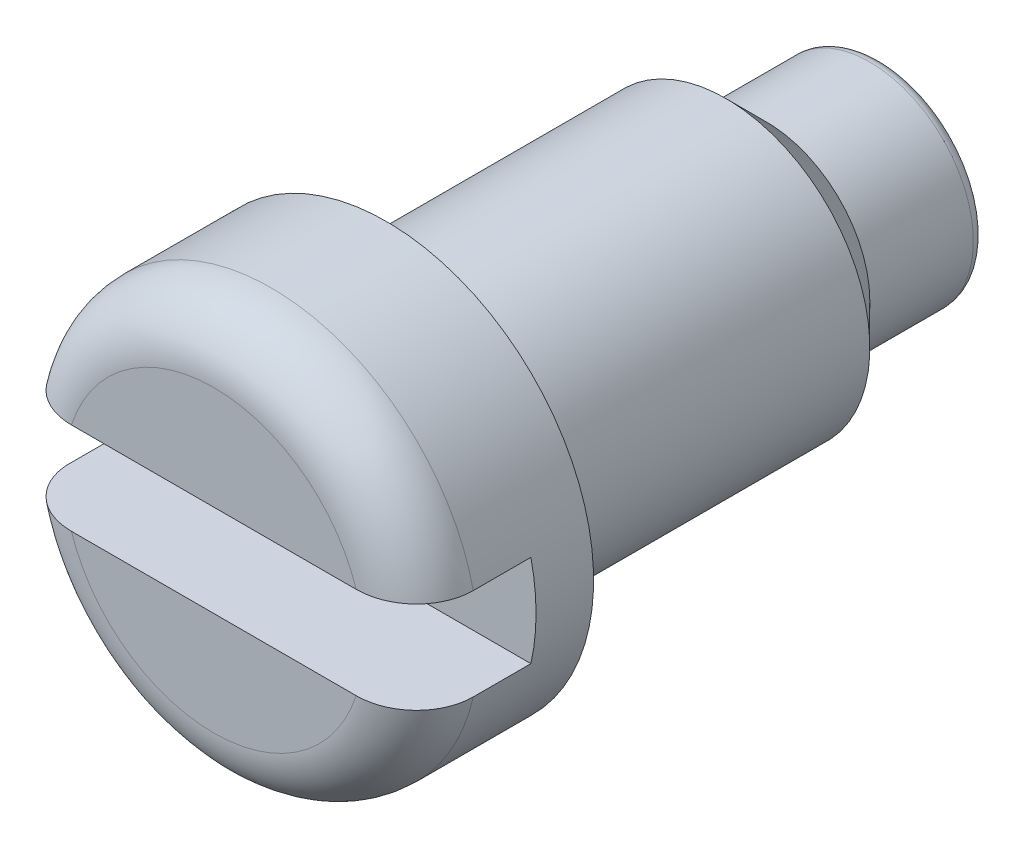
ISO-10303-21;
HEADER;
FILE_DESCRIPTION(('STEP AP214'),'2;1');
FILE_NAME('part.step','',(''),(''),'','','');
FILE_SCHEMA(('AUTOMOTIVE_DESIGN { 1 0 10303 214 1 1 1 1 }'));
ENDSEC;
DATA;
#1=APPLICATION_CONTEXT('core data for automotive mechanical design processes');
#2=APPLICATION_PROTOCOL_DEFINITION('international standard','automotive_design',2000,#1);
#3=PRODUCT_CONTEXT('',#1,'mechanical');
#4=PRODUCT('Part','Part','',(#3));
#5=PRODUCT_RELATED_PRODUCT_CATEGORY('part','',(#4));
#6=PRODUCT_DEFINITION_FORMATION('','',#4);
#7=PRODUCT_DEFINITION_CONTEXT('part definition',#1,'design');
#8=PRODUCT_DEFINITION('design','',#6,#7);
#9=PRODUCT_DEFINITION_SHAPE('','',#8);
#10=(LENGTH_UNIT() NAMED_UNIT(*) SI_UNIT(.MILLI.,.METRE.));
#11=(NAMED_UNIT(*) PLANE_ANGLE_UNIT() SI_UNIT($,.RADIAN.));
#12=(NAMED_UNIT(*) SI_UNIT($,.STERADIAN.) SOLID_ANGLE_UNIT());
#13=UNCERTAINTY_MEASURE_WITH_UNIT(LENGTH_MEASURE(1.E-05),#10,'distance_accuracy_value','');
#14=(GEOMETRIC_REPRESENTATION_CONTEXT(3) GLOBAL_UNCERTAINTY_ASSIGNED_CONTEXT((#13)) GLOBAL_UNIT_ASSIGNED_CONTEXT((#10,
#11,#12)) REPRESENTATION_CONTEXT('',''));
#15=CARTESIAN_POINT('',(0.,0.,0.));
#16=DIRECTION('',(0.,0.,1.));
#17=DIRECTION('',(1.,0.,0.));
#18=AXIS2_PLACEMENT_3D('',#15,#16,#17);
#19=CARTESIAN_POINT('',(0.,0.,4.8));
#20=DIRECTION('',(0.,0.,1.));
#21=DIRECTION('',(1.,0.,0.));
#22=AXIS2_PLACEMENT_3D('',#19,#20,#21);
#23=PLANE('',#22);
#24=CARTESIAN_POINT('',(0.,0.,4.8));
#25=DIRECTION('',(0.,0.,-1.));
#26=DIRECTION('',(-1.,0.,0.));
#27=AXIS2_PLACEMENT_3D('',#24,#25,#26);
#28=CIRCLE('',#27,1.8);
#29=CARTESIAN_POINT('',(1.75499287747883,-0.399999999999,4.8));
#30=VERTEX_POINT('',#29);
#31=CARTESIAN_POINT('',(1.75499287747883,0.399999999999,4.8));
#32=VERTEX_POINT('',#31);
#33=EDGE_CURVE('E86',#30,#32,#28,.F.);
#34=ORIENTED_EDGE('',*,*,#33,.T.);
#35=DIRECTION('',(1.,0.,0.));
#36=VECTOR('',#35,1.);
#37=CARTESIAN_POINT('',(2.049999999993,0.399999999999,4.8));
#38=LINE('',#37,#36);
#39=CARTESIAN_POINT('',(-1.75499287747883,0.399999999999,4.8));
#40=VERTEX_POINT('',#39);
#41=EDGE_CURVE('E84',#32,#40,#38,.F.);
#42=ORIENTED_EDGE('',*,*,#41,.T.);
#43=CARTESIAN_POINT('',(0.,0.,4.8));
#44=DIRECTION('',(0.,0.,-1.));
#45=DIRECTION('',(-1.,0.,0.));
#46=AXIS2_PLACEMENT_3D('',#43,#44,#45);
#47=CIRCLE('',#46,1.8);
#48=CARTESIAN_POINT('',(-1.75499287747883,-0.399999999999,4.8));
#49=VERTEX_POINT('',#48);
#50=EDGE_CURVE('E20',#40,#49,#47,.F.);
#51=ORIENTED_EDGE('',*,*,#50,.T.);
#52=DIRECTION('',(1.,0.,0.));
#53=VECTOR('',#52,1.);
#54=CARTESIAN_POINT('',(-2.049999999993,-0.399999999999,4.8));
#55=LINE('',#54,#53);
#56=EDGE_CURVE('E76',#49,#30,#55,.T.);
#57=ORIENTED_EDGE('',*,*,#56,.T.);
#58=EDGE_LOOP('',(#34,#42,#51,#57));
#59=FACE_BOUND('',#58,.T.);
#60=ADVANCED_FACE('F17',(#59),#23,.T.);
#61=CARTESIAN_POINT('',(-2.049999999993,-0.399999999999,4.8));
#62=DIRECTION('',(0.,-1.,0.));
#63=DIRECTION('',(0.,0.,-1.));
#64=AXIS2_PLACEMENT_3D('',#61,#62,#63);
#65=PLANE('',#64);
#66=ORIENTED_EDGE('',*,*,#56,.F.);
#67=DIRECTION('',(0.,0.,-1.));
#68=VECTOR('',#67,1.);
#69=CARTESIAN_POINT('',(-1.754992877479,-0.399999999999,4.8));
#70=LINE('',#69,#68);
#71=CARTESIAN_POINT('',(-1.75499287747883,-0.399999999999,5.3));
#72=VERTEX_POINT('',#71);
#73=EDGE_CURVE('E68',#72,#49,#70,.T.);
#74=ORIENTED_EDGE('',*,*,#73,.F.);
#75=CARTESIAN_POINT('',(-1.236931687686,-0.399999999999,5.8));
#76=CARTESIAN_POINT('',(-1.26700905585124,-0.399999999999001,5.80002573745396));
#77=CARTESIAN_POINT('',(-1.29709950344371,-0.399999999999,5.79754380325796));
#78=CARTESIAN_POINT('',(-1.35648143468961,-0.399999999999,5.7876315300619));
#79=CARTESIAN_POINT('',(-1.38577213300459,-0.399999999998999,5.78019649713277));
#80=CARTESIAN_POINT('',(-1.44271310964251,-0.399999999998999,5.76042991049008));
#81=CARTESIAN_POINT('',(-1.47036078089464,-0.399999999999,5.74809080178561));
#82=CARTESIAN_POINT('',(-1.52307448384268,-0.399999999999,5.71880331185986));
#83=CARTESIAN_POINT('',(-1.54814257299465,-0.399999999998999,5.70185864390385));
#84=CARTESIAN_POINT('',(-1.59414406168469,-0.399999999998999,5.66440704408986));
#85=CARTESIAN_POINT('',(-1.61518357326936,-0.399999999999,5.64403048858045));
#86=CARTESIAN_POINT('',(-1.65339701900803,-0.399999999999,5.59993022899114));
#87=CARTESIAN_POINT('',(-1.6705721063531,-0.399999999999,5.57620752688897));
#88=CARTESIAN_POINT('',(-1.69999718769055,-0.399999999999001,5.52692793815747));
#89=CARTESIAN_POINT('',(-1.71238872745395,-0.399999999999001,5.50145538443155));
#90=CARTESIAN_POINT('',(-1.73260730352817,-0.399999999998999,5.44877186072495));
#91=CARTESIAN_POINT('',(-1.74043896749163,-0.399999999998995,5.42156268441636));
#92=CARTESIAN_POINT('',(-1.74890179115345,-0.399999999999001,5.37843546674783));
#93=CARTESIAN_POINT('',(-1.75118512917164,-0.399999999999006,5.36282395622846));
#94=CARTESIAN_POINT('',(-1.75422988660471,-0.399999999998994,5.33147747763133));
#95=CARTESIAN_POINT('',(-1.75499363988542,-0.399999999998979,5.31574273619604));
#96=CARTESIAN_POINT('',(-1.75499287747866,-0.39999999999894,5.30000000000003));
#97=B_SPLINE_CURVE_WITH_KNOTS('',3,(#75,#76,#77,#78,#79,#80,#81,#82,#83,#84,#85,#86,#87,#88,#89,
#90,#91,#92,#93,#94,#95,#96),.UNSPECIFIED.,.F.,.F.,(4,2,2,2,2,2,2,2,2,2,4),(0.,
0.090149752293837,0.180385059039494,0.270759920308507,0.361062131239589,0.448493486415542,
0.535898716309015,0.620471960211465,0.704959223511635,0.752225847214873,0.799419819900953),.UNSPECIFIED.);
#98=CARTESIAN_POINT('',(-1.236931687686,-0.399999999999,5.8));
#99=VERTEX_POINT('',#98);
#100=EDGE_CURVE('E77',#99,#72,#97,.T.);
#101=ORIENTED_EDGE('',*,*,#100,.F.);
#102=DIRECTION('',(1.,0.,0.));
#103=VECTOR('',#102,1.);
#104=CARTESIAN_POINT('',(0.,-0.399999999999,5.8));
#105=LINE('',#104,#103);
#106=CARTESIAN_POINT('',(1.236931687686,-0.399999999999,5.8));
#107=VERTEX_POINT('',#106);
#108=EDGE_CURVE('E179',#107,#99,#105,.F.);
#109=ORIENTED_EDGE('',*,*,#108,.F.);
#110=CARTESIAN_POINT('',(1.75499287747865,-0.399999999999,5.3));
#111=CARTESIAN_POINT('',(1.75501885424213,-0.399999999999,5.32757551877228));
#112=CARTESIAN_POINT('',(1.75265482457824,-0.399999999999,5.35514087257659));
#113=CARTESIAN_POINT('',(1.74334196207252,-0.399999999999,5.40944865978954));
#114=CARTESIAN_POINT('',(1.73639940190032,-0.399999999999,5.43619216675378));
#115=CARTESIAN_POINT('',(1.71812100447126,-0.399999999999,5.48814096594942));
#116=CARTESIAN_POINT('',(1.70678386281084,-0.399999999999,5.51334579889673));
#117=CARTESIAN_POINT('',(1.68007639555672,-0.399999999999,5.56151542425157));
#118=CARTESIAN_POINT('',(1.66470611762129,-0.399999999999,5.58448024312423));
#119=CARTESIAN_POINT('',(1.63024567362973,-0.399999999999,5.62775012602371));
#120=CARTESIAN_POINT('',(1.61112441495792,-0.399999999999,5.64803040678852));
#121=CARTESIAN_POINT('',(1.56981598352366,-0.399999999999,5.68518427489338));
#122=CARTESIAN_POINT('',(1.54762818294722,-0.399999999999,5.70205716289155));
#123=CARTESIAN_POINT('',(1.50026966146438,-0.399999999999,5.73235609047143));
#124=CARTESIAN_POINT('',(1.47504071499979,-0.399999999999,5.74569097777834));
#125=CARTESIAN_POINT('',(1.42275199747813,-0.399999999999,5.7680958694082));
#126=CARTESIAN_POINT('',(1.39569203468001,-0.399999999999,5.77716542627963));
#127=CARTESIAN_POINT('',(1.34664835586578,-0.399999999999,5.7893590972896));
#128=CARTESIAN_POINT('',(1.32487651312343,-0.399999999999,5.793357537986));
#129=CARTESIAN_POINT('',(1.28104726667997,-0.399999999999,5.79867822825874));
#130=CARTESIAN_POINT('',(1.25899044663075,-0.399999999999,5.80000527545084));
#131=CARTESIAN_POINT('',(1.236931687686,-0.399999999999001,5.8));
#132=B_SPLINE_CURVE_WITH_KNOTS('',3,(#110,#111,#112,#113,#114,#115,#116,#117,#118,#119,#120,
#121,#122,#123,#124,#125,#126,#127,#128,#129,#130,#131),.UNSPECIFIED.,.F.,.F.,(4,2,2,2,2,2,2,2,
2,2,4),(0.,0.0826102504867563,0.16510755789809,0.247629371007031,0.330150209026178,
0.413386420332311,0.496639697924671,0.581865776964978,0.667100794594715,0.733350226854223,
0.799480573738034),.UNSPECIFIED.);
#133=CARTESIAN_POINT('',(1.75499287747883,-0.399999999999,5.3));
#134=VERTEX_POINT('',#133);
#135=EDGE_CURVE('E222',#134,#107,#132,.T.);
#136=ORIENTED_EDGE('',*,*,#135,.F.);
#137=DIRECTION('',(0.,0.,-1.));
#138=VECTOR('',#137,1.);
#139=CARTESIAN_POINT('',(1.754992877479,-0.399999999999,4.8));
#140=LINE('',#139,#138);
#141=EDGE_CURVE('E89',#30,#134,#140,.F.);
#142=ORIENTED_EDGE('',*,*,#141,.F.);
#143=EDGE_LOOP('',(#66,#74,#101,#109,#136,#142));
#144=FACE_BOUND('',#143,.T.);
#145=ADVANCED_FACE('F87',(#144),#65,.F.);
#146=CARTESIAN_POINT('',(2.049999999993,0.399999999999,4.8));
#147=DIRECTION('',(0.,1.,0.));
#148=DIRECTION('',(0.,0.,1.));
#149=AXIS2_PLACEMENT_3D('',#146,#147,#148);
#150=PLANE('',#149);
#151=ORIENTED_EDGE('',*,*,#41,.F.);
#152=DIRECTION('',(0.,0.,1.));
#153=VECTOR('',#152,1.);
#154=CARTESIAN_POINT('',(1.754992877479,0.399999999999,4.8));
#155=LINE('',#154,#153);
#156=CARTESIAN_POINT('',(1.75499287747883,0.399999999999,5.3));
#157=VERTEX_POINT('',#156);
#158=EDGE_CURVE('E103',#157,#32,#155,.F.);
#159=ORIENTED_EDGE('',*,*,#158,.F.);
#160=CARTESIAN_POINT('',(1.236931687686,0.399999999999,5.8));
#161=CARTESIAN_POINT('',(1.26700905585124,0.399999999999,5.80002573745396));
#162=CARTESIAN_POINT('',(1.29709950344371,0.399999999999,5.79754380325796));
#163=CARTESIAN_POINT('',(1.35648143468961,0.399999999999,5.7876315300619));
#164=CARTESIAN_POINT('',(1.38577213300458,0.399999999999,5.78019649713277));
#165=CARTESIAN_POINT('',(1.44271310964251,0.399999999999,5.76042991049008));
#166=CARTESIAN_POINT('',(1.47036078089464,0.399999999999,5.74809080178561));
#167=CARTESIAN_POINT('',(1.52307448384268,0.399999999999,5.71880331185986));
#168=CARTESIAN_POINT('',(1.54814257299465,0.399999999999,5.70185864390385));
#169=CARTESIAN_POINT('',(1.59414406168469,0.399999999999,5.66440704408986));
#170=CARTESIAN_POINT('',(1.61518357326936,0.399999999999,5.64403048858045));
#171=CARTESIAN_POINT('',(1.65339701900804,0.399999999999,5.59993022899114));
#172=CARTESIAN_POINT('',(1.6705721063531,0.399999999999,5.57620752688898));
#173=CARTESIAN_POINT('',(1.69999718769055,0.399999999999,5.52692793815747));
#174=CARTESIAN_POINT('',(1.71238872745395,0.399999999999001,5.50145538443155));
#175=CARTESIAN_POINT('',(1.73260730352817,0.399999999998999,5.44877186072495));
#176=CARTESIAN_POINT('',(1.74043896749163,0.399999999998997,5.42156268441636));
#177=CARTESIAN_POINT('',(1.74890179115345,0.399999999999002,5.37843546674783));
#178=CARTESIAN_POINT('',(1.75118512917164,0.399999999999006,5.36282395622846));
#179=CARTESIAN_POINT('',(1.75422988660471,0.399999999998994,5.33147747763133));
#180=CARTESIAN_POINT('',(1.75499363988542,0.399999999998978,5.31574273619604));
#181=CARTESIAN_POINT('',(1.75499287747866,0.399999999998941,5.30000000000003));
#182=B_SPLINE_CURVE_WITH_KNOTS('',3,(#160,#161,#162,#163,#164,#165,#166,#167,#168,#169,#170,
#171,#172,#173,#174,#175,#176,#177,#178,#179,#180,#181),.UNSPECIFIED.,.F.,.F.,(4,2,2,2,2,2,2,2,
2,2,4),(0.,0.0901497522938361,0.180385059039493,0.270759920308506,0.361062131239588,
0.448493486415541,0.535898716309015,0.620471960211465,0.704959223511634,0.752225847214872,
0.799419819900953),.UNSPECIFIED.);
#183=CARTESIAN_POINT('',(1.236931687686,0.399999999999,5.8));
#184=VERTEX_POINT('',#183);
#185=EDGE_CURVE('E35',#184,#157,#182,.T.);
#186=ORIENTED_EDGE('',*,*,#185,.F.);
#187=DIRECTION('',(1.,0.,0.));
#188=VECTOR('',#187,1.);
#189=CARTESIAN_POINT('',(0.,0.399999999999,5.8));
#190=LINE('',#189,#188);
#191=CARTESIAN_POINT('',(-1.236931687686,0.399999999999,5.8));
#192=VERTEX_POINT('',#191);
#193=EDGE_CURVE('E171',#192,#184,#190,.T.);
#194=ORIENTED_EDGE('',*,*,#193,.F.);
#195=CARTESIAN_POINT('',(-1.75499287747865,0.399999999999,5.3));
#196=CARTESIAN_POINT('',(-1.75501885424213,0.399999999999,5.32757551877228));
#197=CARTESIAN_POINT('',(-1.75265482457824,0.399999999999,5.35514087257659));
#198=CARTESIAN_POINT('',(-1.74334196207252,0.399999999999,5.40944865978954));
#199=CARTESIAN_POINT('',(-1.73639940190032,0.399999999999,5.43619216675378));
#200=CARTESIAN_POINT('',(-1.71812100447126,0.399999999999,5.48814096594942));
#201=CARTESIAN_POINT('',(-1.70678386281084,0.399999999999,5.51334579889673));
#202=CARTESIAN_POINT('',(-1.68007639555672,0.399999999999,5.56151542425157));
#203=CARTESIAN_POINT('',(-1.66470611762129,0.399999999999,5.58448024312422));
#204=CARTESIAN_POINT('',(-1.63024567362973,0.399999999999,5.62775012602371));
#205=CARTESIAN_POINT('',(-1.61112441495792,0.399999999999,5.64803040678852));
#206=CARTESIAN_POINT('',(-1.56981598352366,0.399999999999,5.68518427489338));
#207=CARTESIAN_POINT('',(-1.54762818294722,0.399999999999,5.70205716289155));
#208=CARTESIAN_POINT('',(-1.50026966146438,0.399999999999,5.73235609047143));
#209=CARTESIAN_POINT('',(-1.47504071499979,0.399999999999,5.74569097777834));
#210=CARTESIAN_POINT('',(-1.42275199747813,0.399999999999,5.7680958694082));
#211=CARTESIAN_POINT('',(-1.39569203468001,0.399999999999,5.77716542627963));
#212=CARTESIAN_POINT('',(-1.34664835586578,0.399999999999,5.7893590972896));
#213=CARTESIAN_POINT('',(-1.32487651312343,0.399999999999,5.793357537986));
#214=CARTESIAN_POINT('',(-1.28104726667997,0.399999999999,5.79867822825874));
#215=CARTESIAN_POINT('',(-1.25899044663075,0.399999999999,5.80000527545084));
#216=CARTESIAN_POINT('',(-1.236931687686,0.399999999999,5.8));
#217=B_SPLINE_CURVE_WITH_KNOTS('',3,(#195,#196,#197,#198,#199,#200,#201,#202,#203,#204,#205,
#206,#207,#208,#209,#210,#211,#212,#213,#214,#215,#216),.UNSPECIFIED.,.F.,.F.,(4,2,2,2,2,2,2,2,
2,2,4),(0.,0.0826102504867564,0.165107557898089,0.247629371007031,0.330150209026177,
0.41338642033231,0.49663969792467,0.581865776964978,0.667100794594715,0.733350226854223,
0.799480573738034),.UNSPECIFIED.);
#218=CARTESIAN_POINT('',(-1.75499287747883,0.399999999999,5.3));
#219=VERTEX_POINT('',#218);
#220=EDGE_CURVE('E91',#219,#192,#217,.T.);
#221=ORIENTED_EDGE('',*,*,#220,.F.);
#222=DIRECTION('',(0.,0.,1.));
#223=VECTOR('',#222,1.);
#224=CARTESIAN_POINT('',(-1.754992877479,0.399999999999,4.8));
#225=LINE('',#224,#223);
#226=EDGE_CURVE('E207',#40,#219,#225,.T.);
#227=ORIENTED_EDGE('',*,*,#226,.F.);
#228=EDGE_LOOP('',(#151,#159,#186,#194,#221,#227));
#229=FACE_BOUND('',#228,.T.);
#230=ADVANCED_FACE('F112',(#229),#150,.F.);
#231=CARTESIAN_POINT('',(0.,0.,5.8));
#232=DIRECTION('',(0.,0.,1.));
#233=DIRECTION('',(1.,0.,0.));
#234=AXIS2_PLACEMENT_3D('',#231,#232,#233);
#235=PLANE('',#234);
#236=ORIENTED_EDGE('',*,*,#108,.T.);
#237=CARTESIAN_POINT('',(0.,0.,5.8));
#238=DIRECTION('',(0.,0.,-1.));
#239=DIRECTION('',(0.951485913604352,-0.307692307691452,0.));
#240=AXIS2_PLACEMENT_3D('',#237,#238,#239);
#241=CIRCLE('',#240,1.30000000000036);
#242=EDGE_CURVE('E178',#107,#99,#241,.T.);
#243=ORIENTED_EDGE('',*,*,#242,.F.);
#244=EDGE_LOOP('',(#236,#243));
#245=FACE_BOUND('',#244,.T.);
#246=ADVANCED_FACE('F162',(#245),#235,.T.);
#247=CARTESIAN_POINT('',(0.,0.,5.8));
#248=DIRECTION('',(0.,0.,1.));
#249=DIRECTION('',(1.,0.,0.));
#250=AXIS2_PLACEMENT_3D('',#247,#248,#249);
#251=PLANE('',#250);
#252=ORIENTED_EDGE('',*,*,#193,.T.);
#253=CARTESIAN_POINT('',(0.,0.,5.8));
#254=DIRECTION('',(0.,0.,-1.));
#255=DIRECTION('',(-0.951485913604352,0.307692307691453,0.));
#256=AXIS2_PLACEMENT_3D('',#253,#254,#255);
#257=CIRCLE('',#256,1.30000000000036);
#258=EDGE_CURVE('E184',#192,#184,#257,.T.);
#259=ORIENTED_EDGE('',*,*,#258,.F.);
#260=EDGE_LOOP('',(#252,#259));
#261=FACE_BOUND('',#260,.T.);
#262=ADVANCED_FACE('F159',(#261),#251,.T.);
#263=CARTESIAN_POINT('',(0.,0.,0.));
#264=DIRECTION('',(0.,0.,-1.));
#265=DIRECTION('',(-1.,0.,0.));
#266=AXIS2_PLACEMENT_3D('',#263,#264,#265);
#267=PLANE('',#266);
#268=CARTESIAN_POINT('',(0.,0.,0.));
#269=DIRECTION('',(0.,0.,1.));
#270=DIRECTION('',(-1.,0.,0.));
#271=AXIS2_PLACEMENT_3D('',#268,#269,#270);
#272=CIRCLE('',#271,0.8);
#273=CARTESIAN_POINT('',(-0.8,0.,0.));
#274=VERTEX_POINT('',#273);
#275=EDGE_CURVE('E141',#274,#274,#272,.T.);
#276=ORIENTED_EDGE('',*,*,#275,.F.);
#277=EDGE_LOOP('',(#276));
#278=FACE_BOUND('',#277,.T.);
#279=ADVANCED_FACE('F150',(#278),#267,.T.);
#280=CARTESIAN_POINT('',(0.,0.,5.3));
#281=DIRECTION('',(0.,0.,-1.));
#282=DIRECTION('',(-1.,0.,0.));
#283=AXIS2_PLACEMENT_3D('',#280,#281,#282);
#284=TOROIDAL_SURFACE('',#283,1.3,0.5);
#285=ORIENTED_EDGE('',*,*,#100,.T.);
#286=CARTESIAN_POINT('',(0.,0.,5.3));
#287=DIRECTION('',(0.,0.,-1.));
#288=DIRECTION('',(-1.,0.,0.));
#289=AXIS2_PLACEMENT_3D('',#286,#287,#288);
#290=CIRCLE('',#289,1.8);
#291=EDGE_CURVE('E73',#134,#72,#290,.T.);
#292=ORIENTED_EDGE('',*,*,#291,.F.);
#293=ORIENTED_EDGE('',*,*,#135,.T.);
#294=ORIENTED_EDGE('',*,*,#242,.T.);
#295=EDGE_LOOP('',(#285,#292,#293,#294));
#296=FACE_BOUND('',#295,.T.);
#297=ADVANCED_FACE('F122',(#296),#284,.T.);
#298=CARTESIAN_POINT('',(0.,0.,5.3));
#299=DIRECTION('',(0.,0.,-1.));
#300=DIRECTION('',(-1.,0.,0.));
#301=AXIS2_PLACEMENT_3D('',#298,#299,#300);
#302=TOROIDAL_SURFACE('',#301,1.3,0.5);
#303=ORIENTED_EDGE('',*,*,#185,.T.);
#304=CARTESIAN_POINT('',(0.,0.,5.3));
#305=DIRECTION('',(0.,0.,-1.));
#306=DIRECTION('',(-1.,0.,0.));
#307=AXIS2_PLACEMENT_3D('',#304,#305,#306);
#308=CIRCLE('',#307,1.8);
#309=EDGE_CURVE('E136',#219,#157,#308,.T.);
#310=ORIENTED_EDGE('',*,*,#309,.F.);
#311=ORIENTED_EDGE('',*,*,#220,.T.);
#312=ORIENTED_EDGE('',*,*,#258,.T.);
#313=EDGE_LOOP('',(#303,#310,#311,#312));
#314=FACE_BOUND('',#313,.T.);
#315=ADVANCED_FACE('F115',(#314),#302,.T.);
#316=CARTESIAN_POINT('',(0.,0.,0.1));
#317=DIRECTION('',(0.,0.,-1.));
#318=DIRECTION('',(-1.,0.,0.));
#319=AXIS2_PLACEMENT_3D('',#316,#317,#318);
#320=TOROIDAL_SURFACE('',#319,0.8,0.1);
#321=CARTESIAN_POINT('',(0.,0.,0.1));
#322=DIRECTION('',(0.,0.,-1.));
#323=DIRECTION('',(-1.,0.,0.));
#324=AXIS2_PLACEMENT_3D('',#321,#322,#323);
#325=CIRCLE('',#324,0.9);
#326=CARTESIAN_POINT('',(-0.9,0.,0.1));
#327=VERTEX_POINT('',#326);
#328=EDGE_CURVE('E101',#327,#327,#325,.F.);
#329=ORIENTED_EDGE('',*,*,#328,.F.);
#330=EDGE_LOOP('',(#329));
#331=FACE_BOUND('',#330,.T.);
#332=ORIENTED_EDGE('',*,*,#275,.T.);
#333=EDGE_LOOP('',(#332));
#334=FACE_BOUND('',#333,.T.);
#335=ADVANCED_FACE('F121',(#331,#334),#320,.T.);
#336=CARTESIAN_POINT('',(0.,0.,5.3));
#337=DIRECTION('',(0.,0.,-1.));
#338=DIRECTION('',(-1.,0.,0.));
#339=AXIS2_PLACEMENT_3D('',#336,#337,#338);
#340=CYLINDRICAL_SURFACE('',#339,1.8);
#341=CARTESIAN_POINT('',(0.,0.,4.3));
#342=DIRECTION('',(0.,0.,-1.));
#343=DIRECTION('',(-1.,0.,0.));
#344=AXIS2_PLACEMENT_3D('',#341,#342,#343);
#345=CIRCLE('',#344,1.8);
#346=CARTESIAN_POINT('',(-1.8,0.,4.3));
#347=VERTEX_POINT('',#346);
#348=EDGE_CURVE('E98',#347,#347,#345,.T.);
#349=ORIENTED_EDGE('',*,*,#348,.F.);
#350=EDGE_LOOP('',(#349));
#351=FACE_BOUND('',#350,.T.);
#352=ORIENTED_EDGE('',*,*,#226,.T.);
#353=ORIENTED_EDGE('',*,*,#309,.T.);
#354=ORIENTED_EDGE('',*,*,#158,.T.);
#355=ORIENTED_EDGE('',*,*,#33,.F.);
#356=ORIENTED_EDGE('',*,*,#141,.T.);
#357=ORIENTED_EDGE('',*,*,#291,.T.);
#358=ORIENTED_EDGE('',*,*,#73,.T.);
#359=ORIENTED_EDGE('',*,*,#50,.F.);
#360=EDGE_LOOP('',(#352,#353,#354,#355,#356,#357,#358,#359));
#361=FACE_BOUND('',#360,.T.);
#362=ADVANCED_FACE('F70',(#351,#361),#340,.T.);
#363=CARTESIAN_POINT('',(0.,0.,1.));
#364=DIRECTION('',(0.,0.,-1.));
#365=DIRECTION('',(-1.,0.,0.));
#366=AXIS2_PLACEMENT_3D('',#363,#364,#365);
#367=CYLINDRICAL_SURFACE('',#366,0.9);
#368=ORIENTED_EDGE('',*,*,#328,.T.);
#369=EDGE_LOOP('',(#368));
#370=FACE_BOUND('',#369,.T.);
#371=CARTESIAN_POINT('',(0.,0.,1.0000000000332));
#372=DIRECTION('',(0.,0.,1.));
#373=DIRECTION('',(1.,0.,0.));
#374=AXIS2_PLACEMENT_3D('',#371,#372,#373);
#375=CIRCLE('',#374,0.900000000001455);
#376=CARTESIAN_POINT('',(0.900000000001455,0.,1.0000000000332));
#377=VERTEX_POINT('',#376);
#378=EDGE_CURVE('E97',#377,#377,#375,.T.);
#379=ORIENTED_EDGE('',*,*,#378,.F.);
#380=EDGE_LOOP('',(#379));
#381=FACE_BOUND('',#380,.T.);
#382=ADVANCED_FACE('F231',(#370,#381),#367,.T.);
#383=CARTESIAN_POINT('',(0.,0.,4.3));
#384=DIRECTION('',(0.,0.,-1.));
#385=DIRECTION('',(-1.,0.,0.));
#386=AXIS2_PLACEMENT_3D('',#383,#384,#385);
#387=PLANE('',#386);
#388=CARTESIAN_POINT('',(0.,0.,4.3));
#389=DIRECTION('',(0.,0.,-1.));
#390=DIRECTION('',(-1.,0.,0.));
#391=AXIS2_PLACEMENT_3D('',#388,#389,#390);
#392=CIRCLE('',#391,1.25);
#393=CARTESIAN_POINT('',(-1.25,0.,4.3));
#394=VERTEX_POINT('',#393);
#395=EDGE_CURVE('E26',#394,#394,#392,.T.);
#396=ORIENTED_EDGE('',*,*,#395,.F.);
#397=EDGE_LOOP('',(#396));
#398=FACE_BOUND('',#397,.T.);
#399=ORIENTED_EDGE('',*,*,#348,.T.);
#400=EDGE_LOOP('',(#399));
#401=FACE_BOUND('',#400,.T.);
#402=ADVANCED_FACE('F242',(#398,#401),#387,.T.);
#403=CARTESIAN_POINT('',(0.,0.,1.34999999994534));
#404=DIRECTION('',(0.,0.,1.));
#405=DIRECTION('',(1.,0.,0.));
#406=AXIS2_PLACEMENT_3D('',#403,#404,#405);
#407=CONICAL_SURFACE('',#406,1.24999999997044,0.785398163478653);
#408=CARTESIAN_POINT('',(0.,0.,1.35));
#409=DIRECTION('',(0.,0.,-1.));
#410=DIRECTION('',(-1.,0.,0.));
#411=AXIS2_PLACEMENT_3D('',#408,#409,#410);
#412=CIRCLE('',#411,1.25);
#413=CARTESIAN_POINT('',(-1.25,0.,1.35));
#414=VERTEX_POINT('',#413);
#415=EDGE_CURVE('E11',#414,#414,#412,.F.);
#416=ORIENTED_EDGE('',*,*,#415,.F.);
#417=EDGE_LOOP('',(#416));
#418=FACE_BOUND('',#417,.T.);
#419=ORIENTED_EDGE('',*,*,#378,.T.);
#420=EDGE_LOOP('',(#419));
#421=FACE_BOUND('',#420,.T.);
#422=ADVANCED_FACE('F236',(#418,#421),#407,.T.);
#423=CARTESIAN_POINT('',(0.,0.,4.3));
#424=DIRECTION('',(0.,0.,-1.));
#425=DIRECTION('',(-1.,0.,0.));
#426=AXIS2_PLACEMENT_3D('',#423,#424,#425);
#427=CYLINDRICAL_SURFACE('',#426,1.25);
#428=ORIENTED_EDGE('',*,*,#415,.T.);
#429=EDGE_LOOP('',(#428));
#430=FACE_BOUND('',#429,.T.);
#431=ORIENTED_EDGE('',*,*,#395,.T.);
#432=EDGE_LOOP('',(#431));
#433=FACE_BOUND('',#432,.T.);
#434=ADVANCED_FACE('F234',(#430,#433),#427,.T.);
#435=CLOSED_SHELL('',(#60,#145,#230,#246,#262,#279,#297,#315,#335,#362,#382,#402,#422,#434));
#436=MANIFOLD_SOLID_BREP('B1',#435);
#437=ADVANCED_BREP_SHAPE_REPRESENTATION('',(#18,#436),#14);
#438=SHAPE_DEFINITION_REPRESENTATION(#9,#437);
ENDSEC;
END-ISO-10303-21;
